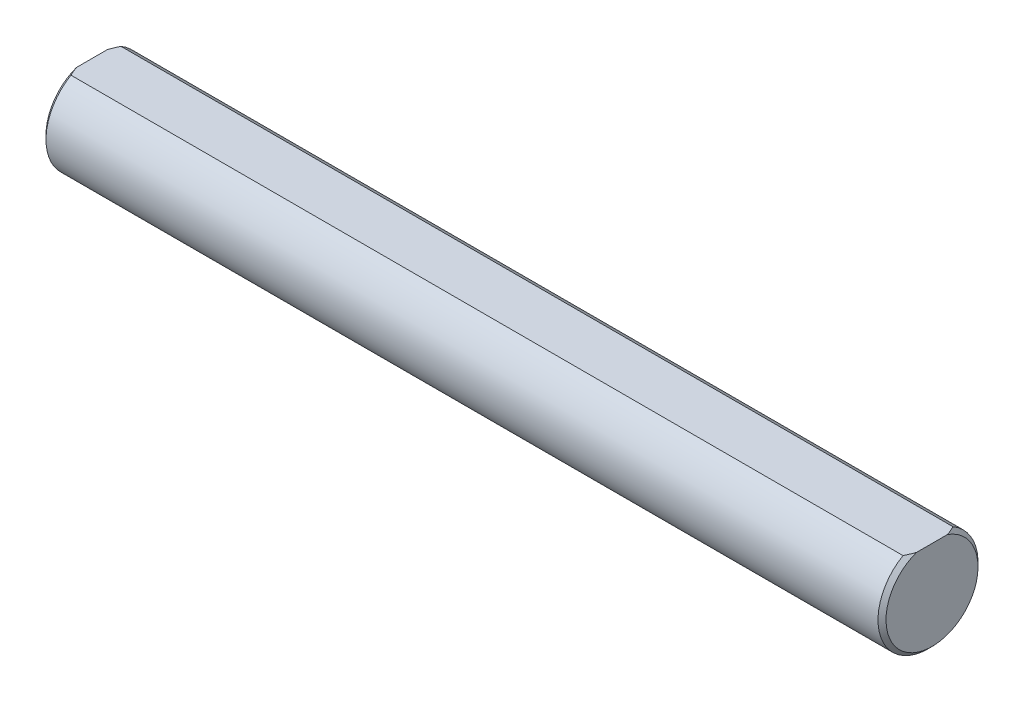
ISO-10303-21;
HEADER;
FILE_DESCRIPTION(('STEP AP214'),'2;1');
FILE_NAME('part.step','',(''),(''),'','','');
FILE_SCHEMA(('AUTOMOTIVE_DESIGN { 1 0 10303 214 1 1 1 1 }'));
ENDSEC;
DATA;
#1=APPLICATION_CONTEXT('core data for automotive mechanical design processes');
#2=APPLICATION_PROTOCOL_DEFINITION('international standard','automotive_design',2000,#1);
#3=PRODUCT_CONTEXT('',#1,'mechanical');
#4=PRODUCT('Part','Part','',(#3));
#5=PRODUCT_RELATED_PRODUCT_CATEGORY('part','',(#4));
#6=PRODUCT_DEFINITION_FORMATION('','',#4);
#7=PRODUCT_DEFINITION_CONTEXT('part definition',#1,'design');
#8=PRODUCT_DEFINITION('design','',#6,#7);
#9=PRODUCT_DEFINITION_SHAPE('','',#8);
#10=(LENGTH_UNIT() NAMED_UNIT(*) SI_UNIT(.MILLI.,.METRE.));
#11=(NAMED_UNIT(*) PLANE_ANGLE_UNIT() SI_UNIT($,.RADIAN.));
#12=(NAMED_UNIT(*) SI_UNIT($,.STERADIAN.) SOLID_ANGLE_UNIT());
#13=UNCERTAINTY_MEASURE_WITH_UNIT(LENGTH_MEASURE(1.E-05),#10,'distance_accuracy_value','');
#14=(GEOMETRIC_REPRESENTATION_CONTEXT(3) GLOBAL_UNCERTAINTY_ASSIGNED_CONTEXT((#13)) GLOBAL_UNIT_ASSIGNED_CONTEXT((#10,
#11,#12)) REPRESENTATION_CONTEXT('',''));
#15=CARTESIAN_POINT('',(0.,0.,0.));
#16=DIRECTION('',(0.,0.,1.));
#17=DIRECTION('',(1.,0.,0.));
#18=AXIS2_PLACEMENT_3D('',#15,#16,#17);
#19=CARTESIAN_POINT('',(53.34,0.,0.));
#20=DIRECTION('',(-1.,0.,0.));
#21=DIRECTION('',(0.,0.,1.));
#22=AXIS2_PLACEMENT_3D('',#19,#20,#21);
#23=CYLINDRICAL_SURFACE('',#22,3.175);
#24=CARTESIAN_POINT('',(53.086,0.,0.));
#25=DIRECTION('',(1.,0.,0.));
#26=DIRECTION('',(0.,0.,-1.));
#27=AXIS2_PLACEMENT_3D('',#24,#25,#26);
#28=CIRCLE('',#27,3.175);
#29=CARTESIAN_POINT('',(53.086,2.74963065701559,-1.5875));
#30=VERTEX_POINT('',#29);
#31=CARTESIAN_POINT('',(53.086,2.74963065701559,1.5875));
#32=VERTEX_POINT('',#31);
#33=EDGE_CURVE('E109',#30,#32,#28,.F.);
#34=ORIENTED_EDGE('',*,*,#33,.T.);
#35=DIRECTION('',(1.,0.,0.));
#36=VECTOR('',#35,1.);
#37=CARTESIAN_POINT('',(0.,2.74963065701559,1.5875));
#38=LINE('',#37,#36);
#39=CARTESIAN_POINT('',(0.25399999999999,2.74963065701559,1.5875));
#40=VERTEX_POINT('',#39);
#41=EDGE_CURVE('E105',#40,#32,#38,.T.);
#42=ORIENTED_EDGE('',*,*,#41,.F.);
#43=CARTESIAN_POINT('',(0.25399999999999,0.,0.));
#44=DIRECTION('',(1.,0.,0.));
#45=DIRECTION('',(0.,0.,-1.));
#46=AXIS2_PLACEMENT_3D('',#43,#44,#45);
#47=CIRCLE('',#46,3.175);
#48=CARTESIAN_POINT('',(0.25399999999999,2.74963065701559,-1.5875));
#49=VERTEX_POINT('',#48);
#50=EDGE_CURVE('E113',#40,#49,#47,.T.);
#51=ORIENTED_EDGE('',*,*,#50,.T.);
#52=DIRECTION('',(1.,0.,0.));
#53=VECTOR('',#52,1.);
#54=CARTESIAN_POINT('',(0.,2.74963065701559,-1.5875));
#55=LINE('',#54,#53);
#56=EDGE_CURVE('E95',#49,#30,#55,.T.);
#57=ORIENTED_EDGE('',*,*,#56,.T.);
#58=EDGE_LOOP('',(#34,#42,#51,#57));
#59=FACE_BOUND('',#58,.T.);
#60=ADVANCED_FACE('F49',(#59),#23,.T.);
#61=CARTESIAN_POINT('',(53.34,0.,0.));
#62=DIRECTION('',(1.,0.,0.));
#63=DIRECTION('',(0.,0.,-1.));
#64=AXIS2_PLACEMENT_3D('',#61,#62,#63);
#65=PLANE('',#64);
#66=DIRECTION('',(0.,0.,-1.));
#67=VECTOR('',#66,1.);
#68=CARTESIAN_POINT('',(53.34,2.74963065701559,1.5875));
#69=LINE('',#68,#67);
#70=CARTESIAN_POINT('',(53.34,2.74963065701559,0.985785093212512));
#71=VERTEX_POINT('',#70);
#72=CARTESIAN_POINT('',(53.34,2.74963065701559,-0.985785093212512));
#73=VERTEX_POINT('',#72);
#74=EDGE_CURVE('E106',#71,#73,#69,.T.);
#75=ORIENTED_EDGE('',*,*,#74,.F.);
#76=CARTESIAN_POINT('',(53.34,0.,0.));
#77=DIRECTION('',(1.,0.,0.));
#78=DIRECTION('',(0.,0.,-1.));
#79=AXIS2_PLACEMENT_3D('',#76,#77,#78);
#80=CIRCLE('',#79,2.921);
#81=EDGE_CURVE('E118',#71,#73,#80,.T.);
#82=ORIENTED_EDGE('',*,*,#81,.T.);
#83=EDGE_LOOP('',(#75,#82));
#84=FACE_BOUND('',#83,.T.);
#85=ADVANCED_FACE('F137',(#84),#65,.T.);
#86=CARTESIAN_POINT('',(0.,0.,0.));
#87=DIRECTION('',(1.,0.,0.));
#88=DIRECTION('',(0.,0.,-1.));
#89=AXIS2_PLACEMENT_3D('',#86,#87,#88);
#90=PLANE('',#89);
#91=CARTESIAN_POINT('',(0.,0.,0.));
#92=DIRECTION('',(1.,0.,0.));
#93=DIRECTION('',(0.,0.,-1.));
#94=AXIS2_PLACEMENT_3D('',#91,#92,#93);
#95=CIRCLE('',#94,2.92100000000001);
#96=CARTESIAN_POINT('',(0.,2.74963065701559,-0.985785093212533));
#97=VERTEX_POINT('',#96);
#98=CARTESIAN_POINT('',(0.,2.74963065701559,0.985785093212533));
#99=VERTEX_POINT('',#98);
#100=EDGE_CURVE('E103',#97,#99,#95,.F.);
#101=ORIENTED_EDGE('',*,*,#100,.T.);
#102=DIRECTION('',(0.,0.,-1.));
#103=VECTOR('',#102,1.);
#104=CARTESIAN_POINT('',(0.,2.74963065701559,1.5875));
#105=LINE('',#104,#103);
#106=EDGE_CURVE('E71',#99,#97,#105,.T.);
#107=ORIENTED_EDGE('',*,*,#106,.T.);
#108=EDGE_LOOP('',(#101,#107));
#109=FACE_BOUND('',#108,.T.);
#110=ADVANCED_FACE('F102',(#109),#90,.F.);
#111=CARTESIAN_POINT('',(53.34,0.,0.));
#112=DIRECTION('',(-1.,0.,0.));
#113=DIRECTION('',(0.,0.,1.));
#114=AXIS2_PLACEMENT_3D('',#111,#112,#113);
#115=CONICAL_SURFACE('',#114,2.921,0.78539816339744);
#116=CARTESIAN_POINT('',(53.0856499421324,2.74963065701559,1.5882));
#117=CARTESIAN_POINT('',(53.1401996989638,2.74963065701559,1.47903148983545));
#118=CARTESIAN_POINT('',(53.1915467736488,2.74963065701559,1.36803725312433));
#119=CARTESIAN_POINT('',(53.2855640164845,2.74963065701559,1.14170613856964));
#120=CARTESIAN_POINT('',(53.3281818395588,2.74963065701559,1.02634771127009));
#121=CARTESIAN_POINT('',(53.401188105863,2.74963065701559,0.793732645811746));
#122=CARTESIAN_POINT('',(53.4317601474436,2.74963065701559,0.676535314799149));
#123=CARTESIAN_POINT('',(53.478863762629,2.74963065701559,0.439559207905033));
#124=CARTESIAN_POINT('',(53.4954305251547,2.74963065701559,0.319787681762696));
#125=CARTESIAN_POINT('',(53.5103772767312,2.74963065701559,0.113390763403408));
#126=CARTESIAN_POINT('',(53.5125911723138,2.74963065701559,0.0270323810887823));
#127=CARTESIAN_POINT('',(53.5088706827955,2.74963065701559,-0.145543469555188));
#128=CARTESIAN_POINT('',(53.5029334400268,2.74963065701559,-0.231760877849848));
#129=CARTESIAN_POINT('',(53.483248527632,2.74963065701559,-0.403381872739591));
#130=CARTESIAN_POINT('',(53.4694921121184,2.74963065701559,-0.488784438972638));
#131=CARTESIAN_POINT('',(53.4349240312319,2.74963065701559,-0.658112847485112));
#132=CARTESIAN_POINT('',(53.4141129063332,2.74963065701559,-0.742038802372471));
#133=CARTESIAN_POINT('',(53.3523041723801,2.74963065701559,-0.957097052575811));
#134=CARTESIAN_POINT('',(53.3066386107287,2.74963065701559,-1.08689353852327));
#135=CARTESIAN_POINT('',(53.229545010794,2.74963065701559,-1.27774543186102));
#136=CARTESIAN_POINT('',(53.202457262408,2.74963065701559,-1.34063930357722));
#137=CARTESIAN_POINT('',(53.1458118782309,2.74963065701559,-1.46526121960739));
#138=CARTESIAN_POINT('',(53.1162557633007,2.74963065701559,-1.52698995347895));
#139=CARTESIAN_POINT('',(53.0856499421324,2.74963065701559,-1.5882));
#140=B_SPLINE_CURVE_WITH_KNOTS('',3,(#116,#117,#118,#119,#120,#121,#122,#123,#124,#125,#126,
#127,#128,#129,#130,#131,#132,#133,#134,#135,#136,#137,#138,#139),.UNSPECIFIED.,.F.,.F.,(4,2,2,
2,2,2,2,2,2,2,2,4),(0.,0.36636981113881,0.734876090737477,1.09752564771278,1.45926129943161,
1.71805477031436,1.97693899350522,2.236113354854,2.49526786486619,2.90718803562741,
3.11259006926563,3.31786646708284),.UNSPECIFIED.);
#141=EDGE_CURVE('E122',#32,#71,#140,.T.);
#142=ORIENTED_EDGE('',*,*,#141,.F.);
#143=ORIENTED_EDGE('',*,*,#33,.F.);
#144=EDGE_CURVE('E78',#73,#30,#140,.T.);
#145=ORIENTED_EDGE('',*,*,#144,.F.);
#146=ORIENTED_EDGE('',*,*,#81,.F.);
#147=EDGE_LOOP('',(#142,#143,#145,#146));
#148=FACE_BOUND('',#147,.T.);
#149=ADVANCED_FACE('F131',(#148),#115,.T.);
#150=CARTESIAN_POINT('',(0.25399999999999,0.,0.));
#151=DIRECTION('',(1.,0.,0.));
#152=DIRECTION('',(0.,0.,-1.));
#153=AXIS2_PLACEMENT_3D('',#150,#151,#152);
#154=CONICAL_SURFACE('',#153,3.175,0.785398163397453);
#155=CARTESIAN_POINT('',(0.254350057867626,2.74963065701559,-1.5882));
#156=CARTESIAN_POINT('',(0.199800301036159,2.74963065701559,-1.47903148983545));
#157=CARTESIAN_POINT('',(0.148453226351223,2.74963065701559,-1.36803725312432));
#158=CARTESIAN_POINT('',(0.0544359835155347,2.74963065701559,-1.14170613856963));
#159=CARTESIAN_POINT('',(0.0118181604412173,2.74963065701559,-1.02634771127008));
#160=CARTESIAN_POINT('',(-0.0611881058630364,2.74963065701559,-0.793732645811729));
#161=CARTESIAN_POINT('',(-0.0917601474436554,2.74963065701559,-0.676535314799128));
#162=CARTESIAN_POINT('',(-0.138863762628965,2.74963065701559,-0.439559207905006));
#163=CARTESIAN_POINT('',(-0.155430525154702,2.74963065701559,-0.319787681762666));
#164=CARTESIAN_POINT('',(-0.170377276731224,2.74963065701559,-0.113390763403372));
#165=CARTESIAN_POINT('',(-0.172591172313852,2.74963065701559,-0.0270323810887437));
#166=CARTESIAN_POINT('',(-0.168870682795494,2.74963065701559,0.145543469555233));
#167=CARTESIAN_POINT('',(-0.162933440026837,2.74963065701559,0.231760877849895));
#168=CARTESIAN_POINT('',(-0.143248527631991,2.74963065701559,0.403381872739644));
#169=CARTESIAN_POINT('',(-0.129492112118363,2.74963065701559,0.488784438972694));
#170=CARTESIAN_POINT('',(-0.0949240312318751,2.74963065701559,0.658112847485173));
#171=CARTESIAN_POINT('',(-0.0741129063332185,2.74963065701559,0.742038802372535));
#172=CARTESIAN_POINT('',(-0.0123041723800454,2.74963065701559,0.957097052575866));
#173=CARTESIAN_POINT('',(0.0333613892713522,2.74963065701559,1.08689353852331));
#174=CARTESIAN_POINT('',(0.110454989206009,2.74963065701559,1.27774543186104));
#175=CARTESIAN_POINT('',(0.137542737592001,2.74963065701559,1.34063930357724));
#176=CARTESIAN_POINT('',(0.194188121769084,2.74963065701559,1.4652612196074));
#177=CARTESIAN_POINT('',(0.223744236699275,2.74963065701559,1.52698995347895));
#178=CARTESIAN_POINT('',(0.254350057867626,2.74963065701559,1.5882));
#179=B_SPLINE_CURVE_WITH_KNOTS('',3,(#155,#156,#157,#158,#159,#160,#161,#162,#163,#164,#165,
#166,#167,#168,#169,#170,#171,#172,#173,#174,#175,#176,#177,#178),.UNSPECIFIED.,.F.,.F.,(4,2,2,
2,2,2,2,2,2,2,2,4),(0.,0.366369811138813,0.734876090737489,1.0975256477128,1.45926129943164,
1.7180547703144,1.97693899350526,2.23611335485405,2.49526786486626,2.90718803562744,
3.11259006926564,3.31786646708284),.UNSPECIFIED.);
#180=EDGE_CURVE('E11',#49,#97,#179,.T.);
#181=ORIENTED_EDGE('',*,*,#180,.F.);
#182=ORIENTED_EDGE('',*,*,#50,.F.);
#183=EDGE_CURVE('E55',#99,#40,#179,.T.);
#184=ORIENTED_EDGE('',*,*,#183,.F.);
#185=ORIENTED_EDGE('',*,*,#100,.F.);
#186=EDGE_LOOP('',(#181,#182,#184,#185));
#187=FACE_BOUND('',#186,.T.);
#188=ADVANCED_FACE('F52',(#187),#154,.T.);
#189=CARTESIAN_POINT('',(0.,2.74963065701559,1.5875));
#190=DIRECTION('',(0.,-1.,0.));
#191=DIRECTION('',(0.,0.,-1.));
#192=AXIS2_PLACEMENT_3D('',#189,#190,#191);
#193=PLANE('',#192);
#194=ORIENTED_EDGE('',*,*,#141,.T.);
#195=ORIENTED_EDGE('',*,*,#74,.T.);
#196=ORIENTED_EDGE('',*,*,#144,.T.);
#197=ORIENTED_EDGE('',*,*,#56,.F.);
#198=ORIENTED_EDGE('',*,*,#180,.T.);
#199=ORIENTED_EDGE('',*,*,#106,.F.);
#200=ORIENTED_EDGE('',*,*,#183,.T.);
#201=ORIENTED_EDGE('',*,*,#41,.T.);
#202=EDGE_LOOP('',(#194,#195,#196,#197,#198,#199,#200,#201));
#203=FACE_BOUND('',#202,.T.);
#204=ADVANCED_FACE('F94',(#203),#193,.F.);
#205=CLOSED_SHELL('',(#60,#85,#110,#149,#188,#204));
#206=MANIFOLD_SOLID_BREP('B2',#205);
#207=ADVANCED_BREP_SHAPE_REPRESENTATION('',(#18,#206),#14);
#208=SHAPE_DEFINITION_REPRESENTATION(#9,#207);
ENDSEC;
END-ISO-10303-21;
